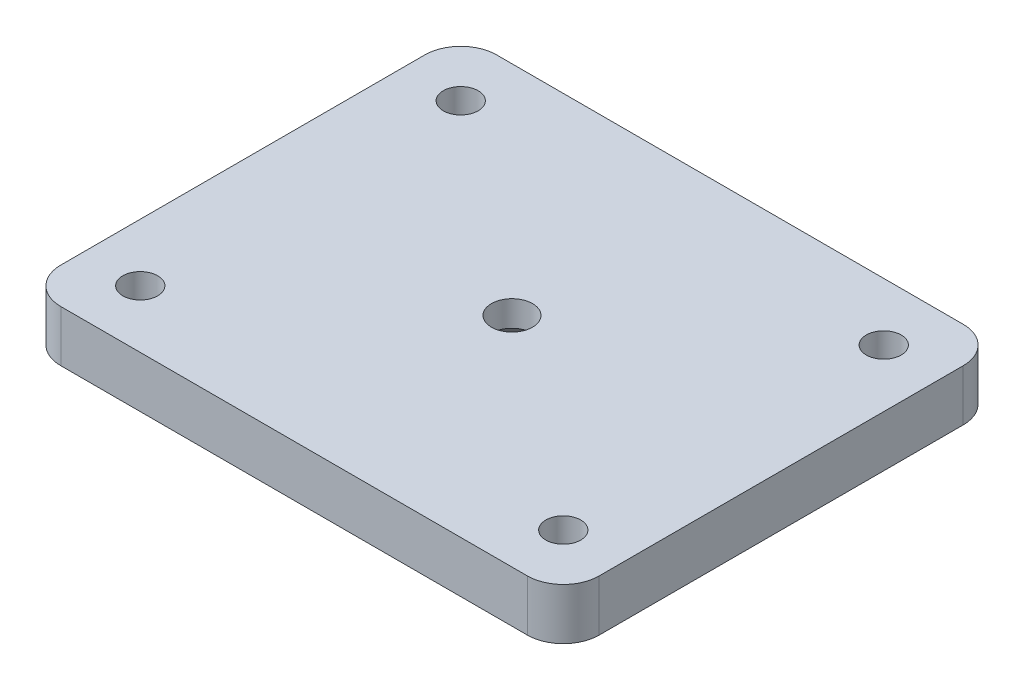
ISO-10303-21;
HEADER;
FILE_DESCRIPTION(('STEP AP214'),'2;1');
FILE_NAME('part.step','',(''),(''),'','','');
FILE_SCHEMA(('AUTOMOTIVE_DESIGN { 1 0 10303 214 1 1 1 1 }'));
ENDSEC;
DATA;
#1=APPLICATION_CONTEXT('core data for automotive mechanical design processes');
#2=APPLICATION_PROTOCOL_DEFINITION('international standard','automotive_design',2000,#1);
#3=PRODUCT_CONTEXT('',#1,'mechanical');
#4=PRODUCT('Part','Part','',(#3));
#5=PRODUCT_RELATED_PRODUCT_CATEGORY('part','',(#4));
#6=PRODUCT_DEFINITION_FORMATION('','',#4);
#7=PRODUCT_DEFINITION_CONTEXT('part definition',#1,'design');
#8=PRODUCT_DEFINITION('design','',#6,#7);
#9=PRODUCT_DEFINITION_SHAPE('','',#8);
#10=(LENGTH_UNIT() NAMED_UNIT(*) SI_UNIT(.MILLI.,.METRE.));
#11=(NAMED_UNIT(*) PLANE_ANGLE_UNIT() SI_UNIT($,.RADIAN.));
#12=(NAMED_UNIT(*) SI_UNIT($,.STERADIAN.) SOLID_ANGLE_UNIT());
#13=UNCERTAINTY_MEASURE_WITH_UNIT(LENGTH_MEASURE(1.E-05),#10,'distance_accuracy_value','');
#14=(GEOMETRIC_REPRESENTATION_CONTEXT(3) GLOBAL_UNCERTAINTY_ASSIGNED_CONTEXT((#13)) GLOBAL_UNIT_ASSIGNED_CONTEXT((#10,
#11,#12)) REPRESENTATION_CONTEXT('',''));
#15=CARTESIAN_POINT('',(0.,0.,0.));
#16=DIRECTION('',(0.,0.,1.));
#17=DIRECTION('',(1.,0.,0.));
#18=AXIS2_PLACEMENT_3D('',#15,#16,#17);
#19=CARTESIAN_POINT('',(52.5,10.,42.5));
#20=DIRECTION('',(-1.,0.,0.));
#21=DIRECTION('',(0.,0.,1.));
#22=AXIS2_PLACEMENT_3D('',#19,#20,#21);
#23=PLANE('',#22);
#24=DIRECTION('',(0.,0.,-1.));
#25=VECTOR('',#24,1.);
#26=CARTESIAN_POINT('',(52.5,0.,42.5));
#27=LINE('',#26,#25);
#28=CARTESIAN_POINT('',(52.5,0.,35.5));
#29=VERTEX_POINT('',#28);
#30=CARTESIAN_POINT('',(52.5,0.,-35.5));
#31=VERTEX_POINT('',#30);
#32=EDGE_CURVE('E133',#29,#31,#27,.T.);
#33=ORIENTED_EDGE('',*,*,#32,.T.);
#34=DIRECTION('',(0.,-1.,0.));
#35=VECTOR('',#34,1.);
#36=CARTESIAN_POINT('',(52.5,10.,-35.5));
#37=LINE('',#36,#35);
#38=CARTESIAN_POINT('',(52.5,10.,-35.5));
#39=VERTEX_POINT('',#38);
#40=EDGE_CURVE('E156',#31,#39,#37,.F.);
#41=ORIENTED_EDGE('',*,*,#40,.T.);
#42=DIRECTION('',(0.,0.,-1.));
#43=VECTOR('',#42,1.);
#44=CARTESIAN_POINT('',(52.5,10.,42.5));
#45=LINE('',#44,#43);
#46=CARTESIAN_POINT('',(52.5,10.,35.5));
#47=VERTEX_POINT('',#46);
#48=EDGE_CURVE('E131',#47,#39,#45,.T.);
#49=ORIENTED_EDGE('',*,*,#48,.F.);
#50=DIRECTION('',(0.,-1.,0.));
#51=VECTOR('',#50,1.);
#52=CARTESIAN_POINT('',(52.5,10.,35.5));
#53=LINE('',#52,#51);
#54=EDGE_CURVE('E153',#47,#29,#53,.T.);
#55=ORIENTED_EDGE('',*,*,#54,.T.);
#56=EDGE_LOOP('',(#33,#41,#49,#55));
#57=FACE_BOUND('',#56,.T.);
#58=ADVANCED_FACE('F38',(#57),#23,.F.);
#59=CARTESIAN_POINT('',(-52.5,10.,-42.5));
#60=DIRECTION('',(0.,0.,1.));
#61=DIRECTION('',(1.,0.,0.));
#62=AXIS2_PLACEMENT_3D('',#59,#60,#61);
#63=PLANE('',#62);
#64=DIRECTION('',(-1.,0.,0.));
#65=VECTOR('',#64,1.);
#66=CARTESIAN_POINT('',(-52.5,0.,-42.5));
#67=LINE('',#66,#65);
#68=CARTESIAN_POINT('',(45.5,0.,-42.5));
#69=VERTEX_POINT('',#68);
#70=CARTESIAN_POINT('',(-45.5,0.,-42.5));
#71=VERTEX_POINT('',#70);
#72=EDGE_CURVE('E129',#69,#71,#67,.T.);
#73=ORIENTED_EDGE('',*,*,#72,.T.);
#74=DIRECTION('',(0.,-1.,0.));
#75=VECTOR('',#74,1.);
#76=CARTESIAN_POINT('',(-45.5,10.,-42.5));
#77=LINE('',#76,#75);
#78=CARTESIAN_POINT('',(-45.5,10.,-42.5));
#79=VERTEX_POINT('',#78);
#80=EDGE_CURVE('E108',#71,#79,#77,.F.);
#81=ORIENTED_EDGE('',*,*,#80,.T.);
#82=DIRECTION('',(-1.,0.,0.));
#83=VECTOR('',#82,1.);
#84=CARTESIAN_POINT('',(-52.5,10.,-42.5));
#85=LINE('',#84,#83);
#86=CARTESIAN_POINT('',(45.5,10.,-42.5));
#87=VERTEX_POINT('',#86);
#88=EDGE_CURVE('E172',#87,#79,#85,.T.);
#89=ORIENTED_EDGE('',*,*,#88,.F.);
#90=DIRECTION('',(0.,-1.,0.));
#91=VECTOR('',#90,1.);
#92=CARTESIAN_POINT('',(45.5,10.,-42.5));
#93=LINE('',#92,#91);
#94=EDGE_CURVE('E113',#87,#69,#93,.T.);
#95=ORIENTED_EDGE('',*,*,#94,.T.);
#96=EDGE_LOOP('',(#73,#81,#89,#95));
#97=FACE_BOUND('',#96,.T.);
#98=ADVANCED_FACE('F244',(#97),#63,.F.);
#99=CARTESIAN_POINT('',(-52.5,10.,42.5));
#100=DIRECTION('',(1.,0.,0.));
#101=DIRECTION('',(0.,0.,-1.));
#102=AXIS2_PLACEMENT_3D('',#99,#100,#101);
#103=PLANE('',#102);
#104=DIRECTION('',(0.,0.,1.));
#105=VECTOR('',#104,1.);
#106=CARTESIAN_POINT('',(-52.5,10.,42.5));
#107=LINE('',#106,#105);
#108=CARTESIAN_POINT('',(-52.5,10.,-35.5));
#109=VERTEX_POINT('',#108);
#110=CARTESIAN_POINT('',(-52.5,10.,35.5));
#111=VERTEX_POINT('',#110);
#112=EDGE_CURVE('E122',#109,#111,#107,.T.);
#113=ORIENTED_EDGE('',*,*,#112,.F.);
#114=DIRECTION('',(0.,-1.,0.));
#115=VECTOR('',#114,1.);
#116=CARTESIAN_POINT('',(-52.5,10.,-35.5));
#117=LINE('',#116,#115);
#118=CARTESIAN_POINT('',(-52.5,0.,-35.5));
#119=VERTEX_POINT('',#118);
#120=EDGE_CURVE('E107',#109,#119,#117,.T.);
#121=ORIENTED_EDGE('',*,*,#120,.T.);
#122=DIRECTION('',(0.,0.,1.));
#123=VECTOR('',#122,1.);
#124=CARTESIAN_POINT('',(-52.5,0.,42.5));
#125=LINE('',#124,#123);
#126=CARTESIAN_POINT('',(-52.5,0.,35.5));
#127=VERTEX_POINT('',#126);
#128=EDGE_CURVE('E120',#119,#127,#125,.T.);
#129=ORIENTED_EDGE('',*,*,#128,.T.);
#130=DIRECTION('',(0.,-1.,0.));
#131=VECTOR('',#130,1.);
#132=CARTESIAN_POINT('',(-52.5,10.,35.5));
#133=LINE('',#132,#131);
#134=EDGE_CURVE('E124',#127,#111,#133,.F.);
#135=ORIENTED_EDGE('',*,*,#134,.T.);
#136=EDGE_LOOP('',(#113,#121,#129,#135));
#137=FACE_BOUND('',#136,.T.);
#138=ADVANCED_FACE('F119',(#137),#103,.F.);
#139=CARTESIAN_POINT('',(-52.5,10.,42.5));
#140=DIRECTION('',(0.,0.,-1.));
#141=DIRECTION('',(-1.,0.,0.));
#142=AXIS2_PLACEMENT_3D('',#139,#140,#141);
#143=PLANE('',#142);
#144=DIRECTION('',(1.,0.,0.));
#145=VECTOR('',#144,1.);
#146=CARTESIAN_POINT('',(-52.5,0.,42.5));
#147=LINE('',#146,#145);
#148=CARTESIAN_POINT('',(-45.5,0.,42.5));
#149=VERTEX_POINT('',#148);
#150=CARTESIAN_POINT('',(45.5,0.,42.5));
#151=VERTEX_POINT('',#150);
#152=EDGE_CURVE('E128',#149,#151,#147,.T.);
#153=ORIENTED_EDGE('',*,*,#152,.T.);
#154=DIRECTION('',(0.,-1.,0.));
#155=VECTOR('',#154,1.);
#156=CARTESIAN_POINT('',(45.5,10.,42.5));
#157=LINE('',#156,#155);
#158=CARTESIAN_POINT('',(45.5,10.,42.5));
#159=VERTEX_POINT('',#158);
#160=EDGE_CURVE('E11',#151,#159,#157,.F.);
#161=ORIENTED_EDGE('',*,*,#160,.T.);
#162=DIRECTION('',(1.,0.,0.));
#163=VECTOR('',#162,1.);
#164=CARTESIAN_POINT('',(-52.5,10.,42.5));
#165=LINE('',#164,#163);
#166=CARTESIAN_POINT('',(-45.5,10.,42.5));
#167=VERTEX_POINT('',#166);
#168=EDGE_CURVE('E137',#167,#159,#165,.T.);
#169=ORIENTED_EDGE('',*,*,#168,.F.);
#170=DIRECTION('',(0.,-1.,0.));
#171=VECTOR('',#170,1.);
#172=CARTESIAN_POINT('',(-45.5,10.,42.5));
#173=LINE('',#172,#171);
#174=EDGE_CURVE('E46',#167,#149,#173,.T.);
#175=ORIENTED_EDGE('',*,*,#174,.T.);
#176=EDGE_LOOP('',(#153,#161,#169,#175));
#177=FACE_BOUND('',#176,.T.);
#178=ADVANCED_FACE('F159',(#177),#143,.F.);
#179=CARTESIAN_POINT('',(0.,10.,0.));
#180=DIRECTION('',(0.,-1.,0.));
#181=DIRECTION('',(0.,0.,-1.));
#182=AXIS2_PLACEMENT_3D('',#179,#180,#181);
#183=PLANE('',#182);
#184=CARTESIAN_POINT('',(0.,10.,0.));
#185=DIRECTION('',(0.,-1.,0.));
#186=DIRECTION('',(0.,0.,-1.));
#187=AXIS2_PLACEMENT_3D('',#184,#185,#186);
#188=CIRCLE('',#187,4.);
#189=CARTESIAN_POINT('',(0.,10.,-4.));
#190=VERTEX_POINT('',#189);
#191=EDGE_CURVE('E207',#190,#190,#188,.T.);
#192=ORIENTED_EDGE('',*,*,#191,.T.);
#193=EDGE_LOOP('',(#192));
#194=FACE_BOUND('',#193,.T.);
#195=CARTESIAN_POINT('',(-41.25,10.,-31.25));
#196=DIRECTION('',(0.,1.,0.));
#197=DIRECTION('',(0.,0.,1.));
#198=AXIS2_PLACEMENT_3D('',#195,#196,#197);
#199=CIRCLE('',#198,3.4);
#200=CARTESIAN_POINT('',(-41.25,10.,-27.85));
#201=VERTEX_POINT('',#200);
#202=EDGE_CURVE('E204',#201,#201,#199,.T.);
#203=ORIENTED_EDGE('',*,*,#202,.F.);
#204=EDGE_LOOP('',(#203));
#205=FACE_BOUND('',#204,.T.);
#206=CARTESIAN_POINT('',(-41.25,10.,31.25));
#207=DIRECTION('',(0.,1.,0.));
#208=DIRECTION('',(0.,0.,1.));
#209=AXIS2_PLACEMENT_3D('',#206,#207,#208);
#210=CIRCLE('',#209,3.4);
#211=CARTESIAN_POINT('',(-41.25,10.,34.65));
#212=VERTEX_POINT('',#211);
#213=EDGE_CURVE('E198',#212,#212,#210,.T.);
#214=ORIENTED_EDGE('',*,*,#213,.F.);
#215=EDGE_LOOP('',(#214));
#216=FACE_BOUND('',#215,.T.);
#217=CARTESIAN_POINT('',(41.25,10.,31.25));
#218=DIRECTION('',(0.,1.,0.));
#219=DIRECTION('',(0.,0.,1.));
#220=AXIS2_PLACEMENT_3D('',#217,#218,#219);
#221=CIRCLE('',#220,3.4);
#222=CARTESIAN_POINT('',(41.25,10.,34.65));
#223=VERTEX_POINT('',#222);
#224=EDGE_CURVE('E190',#223,#223,#221,.T.);
#225=ORIENTED_EDGE('',*,*,#224,.F.);
#226=EDGE_LOOP('',(#225));
#227=FACE_BOUND('',#226,.T.);
#228=CARTESIAN_POINT('',(41.25,10.,-31.25));
#229=DIRECTION('',(0.,1.,0.));
#230=DIRECTION('',(0.,0.,1.));
#231=AXIS2_PLACEMENT_3D('',#228,#229,#230);
#232=CIRCLE('',#231,3.4);
#233=CARTESIAN_POINT('',(41.25,10.,-27.85));
#234=VERTEX_POINT('',#233);
#235=EDGE_CURVE('E182',#234,#234,#232,.T.);
#236=ORIENTED_EDGE('',*,*,#235,.F.);
#237=EDGE_LOOP('',(#236));
#238=FACE_BOUND('',#237,.T.);
#239=ORIENTED_EDGE('',*,*,#88,.T.);
#240=CARTESIAN_POINT('',(-45.5,10.,-35.5));
#241=DIRECTION('',(0.,-1.,0.));
#242=DIRECTION('',(0.,0.,-1.));
#243=AXIS2_PLACEMENT_3D('',#240,#241,#242);
#244=CIRCLE('',#243,7.);
#245=EDGE_CURVE('E151',#79,#109,#244,.F.);
#246=ORIENTED_EDGE('',*,*,#245,.T.);
#247=ORIENTED_EDGE('',*,*,#112,.T.);
#248=CARTESIAN_POINT('',(-45.5,10.,35.5));
#249=DIRECTION('',(0.,-1.,0.));
#250=DIRECTION('',(0.,0.,-1.));
#251=AXIS2_PLACEMENT_3D('',#248,#249,#250);
#252=CIRCLE('',#251,7.);
#253=EDGE_CURVE('E58',#111,#167,#252,.F.);
#254=ORIENTED_EDGE('',*,*,#253,.T.);
#255=ORIENTED_EDGE('',*,*,#168,.T.);
#256=CARTESIAN_POINT('',(45.5,10.,35.5));
#257=DIRECTION('',(0.,-1.,0.));
#258=DIRECTION('',(0.,0.,-1.));
#259=AXIS2_PLACEMENT_3D('',#256,#257,#258);
#260=CIRCLE('',#259,7.);
#261=EDGE_CURVE('E147',#159,#47,#260,.F.);
#262=ORIENTED_EDGE('',*,*,#261,.T.);
#263=ORIENTED_EDGE('',*,*,#48,.T.);
#264=CARTESIAN_POINT('',(45.5,10.,-35.5));
#265=DIRECTION('',(0.,-1.,0.));
#266=DIRECTION('',(0.,0.,-1.));
#267=AXIS2_PLACEMENT_3D('',#264,#265,#266);
#268=CIRCLE('',#267,7.);
#269=EDGE_CURVE('E149',#39,#87,#268,.F.);
#270=ORIENTED_EDGE('',*,*,#269,.T.);
#271=EDGE_LOOP('',(#239,#246,#247,#254,#255,#262,#263,#270));
#272=FACE_BOUND('',#271,.T.);
#273=ADVANCED_FACE('F222',(#194,#205,#216,#227,#238,#272),#183,.F.);
#274=CARTESIAN_POINT('',(0.,0.,0.));
#275=DIRECTION('',(0.,-1.,0.));
#276=DIRECTION('',(0.,0.,-1.));
#277=AXIS2_PLACEMENT_3D('',#274,#275,#276);
#278=PLANE('',#277);
#279=CARTESIAN_POINT('',(0.,0.,0.));
#280=DIRECTION('',(0.,-1.,0.));
#281=DIRECTION('',(0.,0.,-1.));
#282=AXIS2_PLACEMENT_3D('',#279,#280,#281);
#283=CIRCLE('',#282,9.);
#284=CARTESIAN_POINT('',(0.,0.,-9.));
#285=VERTEX_POINT('',#284);
#286=EDGE_CURVE('E213',#285,#285,#283,.T.);
#287=ORIENTED_EDGE('',*,*,#286,.F.);
#288=EDGE_LOOP('',(#287));
#289=FACE_BOUND('',#288,.T.);
#290=CARTESIAN_POINT('',(-41.25,0.,-31.25));
#291=DIRECTION('',(0.,1.,0.));
#292=DIRECTION('',(0.,0.,1.));
#293=AXIS2_PLACEMENT_3D('',#290,#291,#292);
#294=CIRCLE('',#293,3.4);
#295=CARTESIAN_POINT('',(-41.25,0.,-27.85));
#296=VERTEX_POINT('',#295);
#297=EDGE_CURVE('E201',#296,#296,#294,.T.);
#298=ORIENTED_EDGE('',*,*,#297,.T.);
#299=EDGE_LOOP('',(#298));
#300=FACE_BOUND('',#299,.T.);
#301=CARTESIAN_POINT('',(-41.25,0.,31.25));
#302=DIRECTION('',(0.,1.,0.));
#303=DIRECTION('',(0.,0.,1.));
#304=AXIS2_PLACEMENT_3D('',#301,#302,#303);
#305=CIRCLE('',#304,3.4);
#306=CARTESIAN_POINT('',(-41.25,0.,34.65));
#307=VERTEX_POINT('',#306);
#308=EDGE_CURVE('E195',#307,#307,#305,.T.);
#309=ORIENTED_EDGE('',*,*,#308,.T.);
#310=EDGE_LOOP('',(#309));
#311=FACE_BOUND('',#310,.T.);
#312=CARTESIAN_POINT('',(41.25,0.,31.25));
#313=DIRECTION('',(0.,1.,0.));
#314=DIRECTION('',(0.,0.,1.));
#315=AXIS2_PLACEMENT_3D('',#312,#313,#314);
#316=CIRCLE('',#315,3.4);
#317=CARTESIAN_POINT('',(41.25,0.,34.65));
#318=VERTEX_POINT('',#317);
#319=EDGE_CURVE('E186',#318,#318,#316,.T.);
#320=ORIENTED_EDGE('',*,*,#319,.T.);
#321=EDGE_LOOP('',(#320));
#322=FACE_BOUND('',#321,.T.);
#323=CARTESIAN_POINT('',(41.25,0.,-31.25));
#324=DIRECTION('',(0.,1.,0.));
#325=DIRECTION('',(0.,0.,1.));
#326=AXIS2_PLACEMENT_3D('',#323,#324,#325);
#327=CIRCLE('',#326,3.4);
#328=CARTESIAN_POINT('',(41.25,0.,-27.85));
#329=VERTEX_POINT('',#328);
#330=EDGE_CURVE('E177',#329,#329,#327,.T.);
#331=ORIENTED_EDGE('',*,*,#330,.T.);
#332=EDGE_LOOP('',(#331));
#333=FACE_BOUND('',#332,.T.);
#334=ORIENTED_EDGE('',*,*,#128,.F.);
#335=CARTESIAN_POINT('',(-45.5,0.,-35.5));
#336=DIRECTION('',(0.,-1.,0.));
#337=DIRECTION('',(0.,0.,-1.));
#338=AXIS2_PLACEMENT_3D('',#335,#336,#337);
#339=CIRCLE('',#338,7.);
#340=EDGE_CURVE('E103',#119,#71,#339,.T.);
#341=ORIENTED_EDGE('',*,*,#340,.T.);
#342=ORIENTED_EDGE('',*,*,#72,.F.);
#343=CARTESIAN_POINT('',(45.5,0.,-35.5));
#344=DIRECTION('',(0.,-1.,0.));
#345=DIRECTION('',(0.,0.,-1.));
#346=AXIS2_PLACEMENT_3D('',#343,#344,#345);
#347=CIRCLE('',#346,7.);
#348=EDGE_CURVE('E114',#69,#31,#347,.T.);
#349=ORIENTED_EDGE('',*,*,#348,.T.);
#350=ORIENTED_EDGE('',*,*,#32,.F.);
#351=CARTESIAN_POINT('',(45.5,0.,35.5));
#352=DIRECTION('',(0.,-1.,0.));
#353=DIRECTION('',(0.,0.,-1.));
#354=AXIS2_PLACEMENT_3D('',#351,#352,#353);
#355=CIRCLE('',#354,7.);
#356=EDGE_CURVE('E140',#29,#151,#355,.T.);
#357=ORIENTED_EDGE('',*,*,#356,.T.);
#358=ORIENTED_EDGE('',*,*,#152,.F.);
#359=CARTESIAN_POINT('',(-45.5,0.,35.5));
#360=DIRECTION('',(0.,-1.,0.));
#361=DIRECTION('',(0.,0.,-1.));
#362=AXIS2_PLACEMENT_3D('',#359,#360,#361);
#363=CIRCLE('',#362,7.);
#364=EDGE_CURVE('E123',#149,#127,#363,.T.);
#365=ORIENTED_EDGE('',*,*,#364,.T.);
#366=EDGE_LOOP('',(#334,#341,#342,#349,#350,#357,#358,#365));
#367=FACE_BOUND('',#366,.T.);
#368=ADVANCED_FACE('F126',(#289,#300,#311,#322,#333,#367),#278,.T.);
#369=CARTESIAN_POINT('',(41.25,10.,-31.25));
#370=DIRECTION('',(0.,1.,0.));
#371=DIRECTION('',(0.,0.,1.));
#372=AXIS2_PLACEMENT_3D('',#369,#370,#371);
#373=CYLINDRICAL_SURFACE('',#372,3.4);
#374=ORIENTED_EDGE('',*,*,#330,.F.);
#375=EDGE_LOOP('',(#374));
#376=FACE_BOUND('',#375,.T.);
#377=ORIENTED_EDGE('',*,*,#235,.T.);
#378=EDGE_LOOP('',(#377));
#379=FACE_BOUND('',#378,.T.);
#380=ADVANCED_FACE('F221',(#376,#379),#373,.F.);
#381=CARTESIAN_POINT('',(41.25,10.,31.25));
#382=DIRECTION('',(0.,1.,0.));
#383=DIRECTION('',(0.,0.,1.));
#384=AXIS2_PLACEMENT_3D('',#381,#382,#383);
#385=CYLINDRICAL_SURFACE('',#384,3.4);
#386=ORIENTED_EDGE('',*,*,#319,.F.);
#387=EDGE_LOOP('',(#386));
#388=FACE_BOUND('',#387,.T.);
#389=ORIENTED_EDGE('',*,*,#224,.T.);
#390=EDGE_LOOP('',(#389));
#391=FACE_BOUND('',#390,.T.);
#392=ADVANCED_FACE('F230',(#388,#391),#385,.F.);
#393=CARTESIAN_POINT('',(-41.25,10.,31.25));
#394=DIRECTION('',(0.,1.,0.));
#395=DIRECTION('',(0.,0.,1.));
#396=AXIS2_PLACEMENT_3D('',#393,#394,#395);
#397=CYLINDRICAL_SURFACE('',#396,3.4);
#398=ORIENTED_EDGE('',*,*,#308,.F.);
#399=EDGE_LOOP('',(#398));
#400=FACE_BOUND('',#399,.T.);
#401=ORIENTED_EDGE('',*,*,#213,.T.);
#402=EDGE_LOOP('',(#401));
#403=FACE_BOUND('',#402,.T.);
#404=ADVANCED_FACE('F233',(#400,#403),#397,.F.);
#405=CARTESIAN_POINT('',(-41.25,10.,-31.25));
#406=DIRECTION('',(0.,1.,0.));
#407=DIRECTION('',(0.,0.,1.));
#408=AXIS2_PLACEMENT_3D('',#405,#406,#407);
#409=CYLINDRICAL_SURFACE('',#408,3.4);
#410=ORIENTED_EDGE('',*,*,#297,.F.);
#411=EDGE_LOOP('',(#410));
#412=FACE_BOUND('',#411,.T.);
#413=ORIENTED_EDGE('',*,*,#202,.T.);
#414=EDGE_LOOP('',(#413));
#415=FACE_BOUND('',#414,.T.);
#416=ADVANCED_FACE('F270',(#412,#415),#409,.F.);
#417=CARTESIAN_POINT('',(0.,0.,0.));
#418=DIRECTION('',(0.,-1.,0.));
#419=DIRECTION('',(0.,0.,-1.));
#420=AXIS2_PLACEMENT_3D('',#417,#418,#419);
#421=CYLINDRICAL_SURFACE('',#420,4.);
#422=ORIENTED_EDGE('',*,*,#191,.F.);
#423=EDGE_LOOP('',(#422));
#424=FACE_BOUND('',#423,.T.);
#425=CARTESIAN_POINT('',(0.,4.99999999999998,0.));
#426=DIRECTION('',(0.,-1.,0.));
#427=DIRECTION('',(0.,0.,-1.));
#428=AXIS2_PLACEMENT_3D('',#425,#426,#427);
#429=CIRCLE('',#428,4.);
#430=CARTESIAN_POINT('',(0.,4.99999999999998,-4.));
#431=VERTEX_POINT('',#430);
#432=EDGE_CURVE('E210',#431,#431,#429,.T.);
#433=ORIENTED_EDGE('',*,*,#432,.T.);
#434=EDGE_LOOP('',(#433));
#435=FACE_BOUND('',#434,.T.);
#436=ADVANCED_FACE('F274',(#424,#435),#421,.F.);
#437=CARTESIAN_POINT('',(0.,0.,0.));
#438=DIRECTION('',(0.,-1.,0.));
#439=DIRECTION('',(0.,0.,-1.));
#440=AXIS2_PLACEMENT_3D('',#437,#438,#439);
#441=CONICAL_SURFACE('',#440,9.,0.78539816339745);
#442=ORIENTED_EDGE('',*,*,#432,.F.);
#443=EDGE_LOOP('',(#442));
#444=FACE_BOUND('',#443,.T.);
#445=ORIENTED_EDGE('',*,*,#286,.T.);
#446=EDGE_LOOP('',(#445));
#447=FACE_BOUND('',#446,.T.);
#448=ADVANCED_FACE('F217',(#444,#447),#441,.F.);
#449=CARTESIAN_POINT('',(-45.5,10.,-35.5));
#450=DIRECTION('',(0.,-1.,0.));
#451=DIRECTION('',(0.,0.,-1.));
#452=AXIS2_PLACEMENT_3D('',#449,#450,#451);
#453=CYLINDRICAL_SURFACE('',#452,7.);
#454=ORIENTED_EDGE('',*,*,#245,.F.);
#455=ORIENTED_EDGE('',*,*,#80,.F.);
#456=ORIENTED_EDGE('',*,*,#340,.F.);
#457=ORIENTED_EDGE('',*,*,#120,.F.);
#458=EDGE_LOOP('',(#454,#455,#456,#457));
#459=FACE_BOUND('',#458,.T.);
#460=ADVANCED_FACE('F106',(#459),#453,.T.);
#461=CARTESIAN_POINT('',(45.5,10.,-35.5));
#462=DIRECTION('',(0.,-1.,0.));
#463=DIRECTION('',(0.,0.,-1.));
#464=AXIS2_PLACEMENT_3D('',#461,#462,#463);
#465=CYLINDRICAL_SURFACE('',#464,7.);
#466=ORIENTED_EDGE('',*,*,#269,.F.);
#467=ORIENTED_EDGE('',*,*,#40,.F.);
#468=ORIENTED_EDGE('',*,*,#348,.F.);
#469=ORIENTED_EDGE('',*,*,#94,.F.);
#470=EDGE_LOOP('',(#466,#467,#468,#469));
#471=FACE_BOUND('',#470,.T.);
#472=ADVANCED_FACE('F246',(#471),#465,.T.);
#473=CARTESIAN_POINT('',(45.5,10.,35.5));
#474=DIRECTION('',(0.,-1.,0.));
#475=DIRECTION('',(0.,0.,-1.));
#476=AXIS2_PLACEMENT_3D('',#473,#474,#475);
#477=CYLINDRICAL_SURFACE('',#476,7.);
#478=ORIENTED_EDGE('',*,*,#261,.F.);
#479=ORIENTED_EDGE('',*,*,#160,.F.);
#480=ORIENTED_EDGE('',*,*,#356,.F.);
#481=ORIENTED_EDGE('',*,*,#54,.F.);
#482=EDGE_LOOP('',(#478,#479,#480,#481));
#483=FACE_BOUND('',#482,.T.);
#484=ADVANCED_FACE('F166',(#483),#477,.T.);
#485=CARTESIAN_POINT('',(-45.5,10.,35.5));
#486=DIRECTION('',(0.,-1.,0.));
#487=DIRECTION('',(0.,0.,-1.));
#488=AXIS2_PLACEMENT_3D('',#485,#486,#487);
#489=CYLINDRICAL_SURFACE('',#488,7.);
#490=ORIENTED_EDGE('',*,*,#253,.F.);
#491=ORIENTED_EDGE('',*,*,#134,.F.);
#492=ORIENTED_EDGE('',*,*,#364,.F.);
#493=ORIENTED_EDGE('',*,*,#174,.F.);
#494=EDGE_LOOP('',(#490,#491,#492,#493));
#495=FACE_BOUND('',#494,.T.);
#496=ADVANCED_FACE('F40',(#495),#489,.T.);
#497=CLOSED_SHELL('',(#58,#98,#138,#178,#273,#368,#380,#392,#404,#416,#436,#448,#460,#472,#484,#496));
#498=MANIFOLD_SOLID_BREP('B2',#497);
#499=ADVANCED_BREP_SHAPE_REPRESENTATION('',(#18,#498),#14);
#500=SHAPE_DEFINITION_REPRESENTATION(#9,#499);
ENDSEC;
END-ISO-10303-21;
